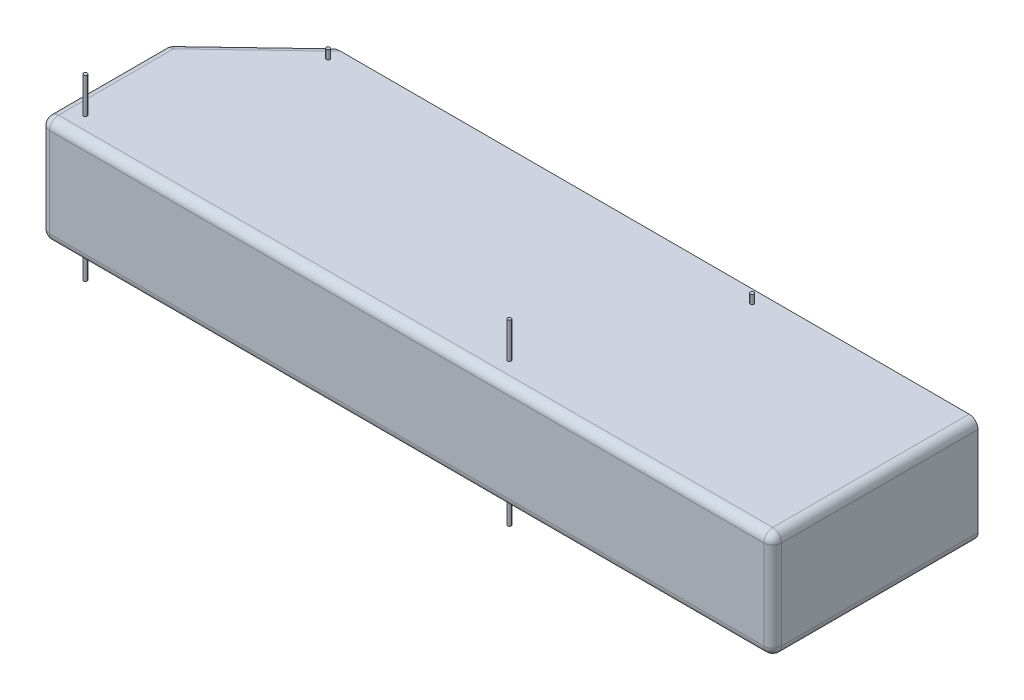
ISO-10303-21;
HEADER;
FILE_DESCRIPTION(('STEP AP214'),'2;1');
FILE_NAME('part.step','',(''),(''),'','','');
FILE_SCHEMA(('AUTOMOTIVE_DESIGN { 1 0 10303 214 1 1 1 1 }'));
ENDSEC;
DATA;
#1=APPLICATION_CONTEXT('core data for automotive mechanical design processes');
#2=APPLICATION_PROTOCOL_DEFINITION('international standard','automotive_design',2000,#1);
#3=PRODUCT_CONTEXT('',#1,'mechanical');
#4=PRODUCT('Part','Part','',(#3));
#5=PRODUCT_RELATED_PRODUCT_CATEGORY('part','',(#4));
#6=PRODUCT_DEFINITION_FORMATION('','',#4);
#7=PRODUCT_DEFINITION_CONTEXT('part definition',#1,'design');
#8=PRODUCT_DEFINITION('design','',#6,#7);
#9=PRODUCT_DEFINITION_SHAPE('','',#8);
#10=(LENGTH_UNIT() NAMED_UNIT(*) SI_UNIT(.MILLI.,.METRE.));
#11=(NAMED_UNIT(*) PLANE_ANGLE_UNIT() SI_UNIT($,.RADIAN.));
#12=(NAMED_UNIT(*) SI_UNIT($,.STERADIAN.) SOLID_ANGLE_UNIT());
#13=UNCERTAINTY_MEASURE_WITH_UNIT(LENGTH_MEASURE(1.E-05),#10,'distance_accuracy_value','');
#14=(GEOMETRIC_REPRESENTATION_CONTEXT(3) GLOBAL_UNCERTAINTY_ASSIGNED_CONTEXT((#13)) GLOBAL_UNIT_ASSIGNED_CONTEXT((#10,
#11,#12)) REPRESENTATION_CONTEXT('',''));
#15=CARTESIAN_POINT('',(0.,0.,0.));
#16=DIRECTION('',(0.,0.,1.));
#17=DIRECTION('',(1.,0.,0.));
#18=AXIS2_PLACEMENT_3D('',#15,#16,#17);
#19=CARTESIAN_POINT('',(-304.,99.9999999999999,14.));
#20=DIRECTION('',(0.,-1.,0.));
#21=DIRECTION('',(1.,0.,0.));
#22=AXIS2_PLACEMENT_3D('',#19,#20,#21);
#23=CYLINDRICAL_SURFACE('',#22,2.);
#24=CARTESIAN_POINT('',(-304.,60.,14.));
#25=DIRECTION('',(0.,-1.,0.));
#26=DIRECTION('',(1.,0.,0.));
#27=AXIS2_PLACEMENT_3D('',#24,#25,#26);
#28=CIRCLE('',#27,2.);
#29=CARTESIAN_POINT('',(-302.,60.,14.));
#30=VERTEX_POINT('',#29);
#31=EDGE_CURVE('E296',#30,#30,#28,.F.);
#32=ORIENTED_EDGE('',*,*,#31,.T.);
#33=EDGE_LOOP('',(#32));
#34=FACE_BOUND('',#33,.T.);
#35=CARTESIAN_POINT('',(-304.,70.,14.));
#36=DIRECTION('',(0.,1.,0.));
#37=DIRECTION('',(-1.,0.,0.));
#38=AXIS2_PLACEMENT_3D('',#35,#36,#37);
#39=CIRCLE('',#38,2.);
#40=CARTESIAN_POINT('',(-306.,70.,14.));
#41=VERTEX_POINT('',#40);
#42=EDGE_CURVE('E43',#41,#41,#39,.T.);
#43=ORIENTED_EDGE('',*,*,#42,.F.);
#44=EDGE_LOOP('',(#43));
#45=FACE_BOUND('',#44,.T.);
#46=ADVANCED_FACE('F39',(#34,#45),#23,.T.);
#47=CARTESIAN_POINT('',(171.,100.,14.));
#48=DIRECTION('',(0.,-1.,0.));
#49=DIRECTION('',(1.,0.,0.));
#50=AXIS2_PLACEMENT_3D('',#47,#48,#49);
#51=CYLINDRICAL_SURFACE('',#50,2.);
#52=CARTESIAN_POINT('',(171.,60.,14.));
#53=DIRECTION('',(0.,-1.,0.));
#54=DIRECTION('',(1.,0.,0.));
#55=AXIS2_PLACEMENT_3D('',#52,#53,#54);
#56=CIRCLE('',#55,2.);
#57=CARTESIAN_POINT('',(173.,60.,14.));
#58=VERTEX_POINT('',#57);
#59=EDGE_CURVE('E292',#58,#58,#56,.F.);
#60=ORIENTED_EDGE('',*,*,#59,.T.);
#61=EDGE_LOOP('',(#60));
#62=FACE_BOUND('',#61,.T.);
#63=CARTESIAN_POINT('',(171.,70.,14.));
#64=DIRECTION('',(0.,1.,0.));
#65=DIRECTION('',(-1.,0.,0.));
#66=AXIS2_PLACEMENT_3D('',#63,#64,#65);
#67=CIRCLE('',#66,2.);
#68=CARTESIAN_POINT('',(169.,70.,14.));
#69=VERTEX_POINT('',#68);
#70=EDGE_CURVE('E346',#69,#69,#67,.T.);
#71=ORIENTED_EDGE('',*,*,#70,.F.);
#72=EDGE_LOOP('',(#71));
#73=FACE_BOUND('',#72,.T.);
#74=ADVANCED_FACE('F362',(#62,#73),#51,.T.);
#75=CARTESIAN_POINT('',(171.,-100.,14.));
#76=DIRECTION('',(0.,1.,0.));
#77=DIRECTION('',(-1.,0.,0.));
#78=AXIS2_PLACEMENT_3D('',#75,#76,#77);
#79=CYLINDRICAL_SURFACE('',#78,2.);
#80=CARTESIAN_POINT('',(171.,-60.,14.));
#81=DIRECTION('',(0.,1.,0.));
#82=DIRECTION('',(-1.,0.,0.));
#83=AXIS2_PLACEMENT_3D('',#80,#81,#82);
#84=CIRCLE('',#83,2.);
#85=CARTESIAN_POINT('',(169.,-60.,14.));
#86=VERTEX_POINT('',#85);
#87=EDGE_CURVE('E276',#86,#86,#84,.F.);
#88=ORIENTED_EDGE('',*,*,#87,.T.);
#89=EDGE_LOOP('',(#88));
#90=FACE_BOUND('',#89,.T.);
#91=CARTESIAN_POINT('',(171.,-70.,14.));
#92=DIRECTION('',(0.,-1.,0.));
#93=DIRECTION('',(1.,0.,0.));
#94=AXIS2_PLACEMENT_3D('',#91,#92,#93);
#95=CIRCLE('',#94,2.);
#96=CARTESIAN_POINT('',(173.,-70.,14.));
#97=VERTEX_POINT('',#96);
#98=EDGE_CURVE('E349',#97,#97,#95,.T.);
#99=ORIENTED_EDGE('',*,*,#98,.F.);
#100=EDGE_LOOP('',(#99));
#101=FACE_BOUND('',#100,.T.);
#102=ADVANCED_FACE('F367',(#90,#101),#79,.T.);
#103=CARTESIAN_POINT('',(-304.,-100.,14.));
#104=DIRECTION('',(0.,1.,0.));
#105=DIRECTION('',(-1.,0.,0.));
#106=AXIS2_PLACEMENT_3D('',#103,#104,#105);
#107=CYLINDRICAL_SURFACE('',#106,2.);
#108=CARTESIAN_POINT('',(-304.,-60.,14.));
#109=DIRECTION('',(0.,1.,0.));
#110=DIRECTION('',(-1.,0.,0.));
#111=AXIS2_PLACEMENT_3D('',#108,#109,#110);
#112=CIRCLE('',#111,2.);
#113=CARTESIAN_POINT('',(-306.,-60.,14.));
#114=VERTEX_POINT('',#113);
#115=EDGE_CURVE('E280',#114,#114,#112,.F.);
#116=ORIENTED_EDGE('',*,*,#115,.T.);
#117=EDGE_LOOP('',(#116));
#118=FACE_BOUND('',#117,.T.);
#119=CARTESIAN_POINT('',(-304.,-70.,14.));
#120=DIRECTION('',(0.,-1.,0.));
#121=DIRECTION('',(1.,0.,0.));
#122=AXIS2_PLACEMENT_3D('',#119,#120,#121);
#123=CIRCLE('',#122,2.);
#124=CARTESIAN_POINT('',(-302.,-70.,14.));
#125=VERTEX_POINT('',#124);
#126=EDGE_CURVE('E334',#125,#125,#123,.T.);
#127=ORIENTED_EDGE('',*,*,#126,.F.);
#128=EDGE_LOOP('',(#127));
#129=FACE_BOUND('',#128,.T.);
#130=ADVANCED_FACE('F391',(#118,#129),#107,.T.);
#131=CARTESIAN_POINT('',(-400.,-50.,230.));
#132=DIRECTION('',(0.,0.,-1.));
#133=DIRECTION('',(-1.,0.,0.));
#134=AXIS2_PLACEMENT_3D('',#131,#132,#133);
#135=CYLINDRICAL_SURFACE('',#134,10.);
#136=DIRECTION('',(0.,0.,-1.));
#137=VECTOR('',#136,1.);
#138=CARTESIAN_POINT('',(-410.,-50.,230.));
#139=LINE('',#138,#137);
#140=CARTESIAN_POINT('',(-410.,-50.,220.));
#141=VERTEX_POINT('',#140);
#142=CARTESIAN_POINT('',(-410.,-50.,91.3643058150663));
#143=VERTEX_POINT('',#142);
#144=EDGE_CURVE('E183',#141,#143,#139,.T.);
#145=ORIENTED_EDGE('',*,*,#144,.T.);
#146=CARTESIAN_POINT('',(-400.,-50.,91.3643058150663));
#147=DIRECTION('',(0.,0.,-1.));
#148=DIRECTION('',(-1.,0.,0.));
#149=AXIS2_PLACEMENT_3D('',#146,#147,#148);
#150=CIRCLE('',#149,10.);
#151=CARTESIAN_POINT('',(-400.,-60.0000000000001,91.3643058150663));
#152=VERTEX_POINT('',#151);
#153=EDGE_CURVE('E49',#143,#152,#150,.F.);
#154=ORIENTED_EDGE('',*,*,#153,.T.);
#155=DIRECTION('',(0.,0.,-1.));
#156=VECTOR('',#155,1.);
#157=CARTESIAN_POINT('',(-400.,-60.0000000000001,230.));
#158=LINE('',#157,#156);
#159=CARTESIAN_POINT('',(-400.,-60.0000000000001,220.));
#160=VERTEX_POINT('',#159);
#161=EDGE_CURVE('E159',#160,#152,#158,.T.);
#162=ORIENTED_EDGE('',*,*,#161,.F.);
#163=CARTESIAN_POINT('',(-400.,-50.,220.));
#164=DIRECTION('',(0.,0.,-1.));
#165=DIRECTION('',(-1.,0.,0.));
#166=AXIS2_PLACEMENT_3D('',#163,#164,#165);
#167=CIRCLE('',#166,10.);
#168=EDGE_CURVE('E203',#160,#141,#167,.T.);
#169=ORIENTED_EDGE('',*,*,#168,.T.);
#170=EDGE_LOOP('',(#145,#154,#162,#169));
#171=FACE_BOUND('',#170,.T.);
#172=ADVANCED_FACE('F394',(#171),#135,.T.);
#173=CARTESIAN_POINT('',(400.,-60.,230.));
#174=DIRECTION('',(0.,1.,0.));
#175=DIRECTION('',(-1.,0.,0.));
#176=AXIS2_PLACEMENT_3D('',#173,#174,#175);
#177=PLANE('',#176);
#178=ORIENTED_EDGE('',*,*,#115,.F.);
#179=EDGE_LOOP('',(#178));
#180=FACE_BOUND('',#179,.T.);
#181=ORIENTED_EDGE('',*,*,#87,.F.);
#182=EDGE_LOOP('',(#181));
#183=FACE_BOUND('',#182,.T.);
#184=CARTESIAN_POINT('',(90.,-60.,205.));
#185=DIRECTION('',(0.,1.,0.));
#186=DIRECTION('',(-1.,0.,0.));
#187=AXIS2_PLACEMENT_3D('',#184,#185,#186);
#188=CIRCLE('',#187,2.);
#189=CARTESIAN_POINT('',(88.,-60.,205.));
#190=VERTEX_POINT('',#189);
#191=EDGE_CURVE('E272',#190,#190,#188,.F.);
#192=ORIENTED_EDGE('',*,*,#191,.F.);
#193=EDGE_LOOP('',(#192));
#194=FACE_BOUND('',#193,.T.);
#195=CARTESIAN_POINT('',(-385.,-60.0000000000001,205.));
#196=DIRECTION('',(0.,1.,0.));
#197=DIRECTION('',(-1.,0.,0.));
#198=AXIS2_PLACEMENT_3D('',#195,#196,#197);
#199=CIRCLE('',#198,2.);
#200=CARTESIAN_POINT('',(-387.,-60.0000000000001,205.));
#201=VERTEX_POINT('',#200);
#202=EDGE_CURVE('E239',#201,#201,#199,.F.);
#203=ORIENTED_EDGE('',*,*,#202,.F.);
#204=EDGE_LOOP('',(#203));
#205=FACE_BOUND('',#204,.T.);
#206=ORIENTED_EDGE('',*,*,#161,.T.);
#207=DIRECTION('',(-0.724195431730641,0.,0.689594791642505));
#208=VECTOR('',#207,1.);
#209=CARTESIAN_POINT('',(-49.6676407966176,-60.,-242.229859054425));
#210=LINE('',#209,#208);
#211=CARTESIAN_POINT('',(-304.051460805096,-60.,0.));
#212=VERTEX_POINT('',#211);
#213=EDGE_CURVE('E11',#152,#212,#210,.F.);
#214=ORIENTED_EDGE('',*,*,#213,.T.);
#215=DIRECTION('',(1.,0.,0.));
#216=VECTOR('',#215,1.);
#217=CARTESIAN_POINT('',(400.,-60.,0.));
#218=LINE('',#217,#216);
#219=CARTESIAN_POINT('',(400.,-60.,0.));
#220=VERTEX_POINT('',#219);
#221=EDGE_CURVE('E138',#212,#220,#218,.T.);
#222=ORIENTED_EDGE('',*,*,#221,.T.);
#223=DIRECTION('',(0.,0.,-1.));
#224=VECTOR('',#223,1.);
#225=CARTESIAN_POINT('',(400.,-60.,230.));
#226=LINE('',#225,#224);
#227=CARTESIAN_POINT('',(400.,-60.,220.));
#228=VERTEX_POINT('',#227);
#229=EDGE_CURVE('E141',#228,#220,#226,.T.);
#230=ORIENTED_EDGE('',*,*,#229,.F.);
#231=DIRECTION('',(1.,0.,0.));
#232=VECTOR('',#231,1.);
#233=CARTESIAN_POINT('',(400.,-60.,220.));
#234=LINE('',#233,#232);
#235=EDGE_CURVE('E236',#228,#160,#234,.F.);
#236=ORIENTED_EDGE('',*,*,#235,.T.);
#237=EDGE_LOOP('',(#206,#214,#222,#230,#236));
#238=FACE_BOUND('',#237,.T.);
#239=ADVANCED_FACE('F140',(#180,#183,#194,#205,#238),#177,.F.);
#240=CARTESIAN_POINT('',(400.,-50.,230.));
#241=DIRECTION('',(0.,0.,-1.));
#242=DIRECTION('',(-1.,0.,0.));
#243=AXIS2_PLACEMENT_3D('',#240,#241,#242);
#244=CYLINDRICAL_SURFACE('',#243,10.);
#245=DIRECTION('',(0.,0.,-1.));
#246=VECTOR('',#245,1.);
#247=CARTESIAN_POINT('',(410.,-50.,230.));
#248=LINE('',#247,#246);
#249=CARTESIAN_POINT('',(410.,-50.,220.));
#250=VERTEX_POINT('',#249);
#251=CARTESIAN_POINT('',(410.,-50.,0.));
#252=VERTEX_POINT('',#251);
#253=EDGE_CURVE('E160',#250,#252,#248,.T.);
#254=ORIENTED_EDGE('',*,*,#253,.F.);
#255=CARTESIAN_POINT('',(400.,-50.,220.));
#256=DIRECTION('',(0.,0.,-1.));
#257=DIRECTION('',(-1.,0.,0.));
#258=AXIS2_PLACEMENT_3D('',#255,#256,#257);
#259=CIRCLE('',#258,10.);
#260=EDGE_CURVE('E157',#250,#228,#259,.T.);
#261=ORIENTED_EDGE('',*,*,#260,.T.);
#262=ORIENTED_EDGE('',*,*,#229,.T.);
#263=CARTESIAN_POINT('',(400.,-50.,0.));
#264=DIRECTION('',(0.,0.,1.));
#265=DIRECTION('',(1.,0.,0.));
#266=AXIS2_PLACEMENT_3D('',#263,#264,#265);
#267=CIRCLE('',#266,10.);
#268=EDGE_CURVE('E148',#220,#252,#267,.T.);
#269=ORIENTED_EDGE('',*,*,#268,.T.);
#270=EDGE_LOOP('',(#254,#261,#262,#269));
#271=FACE_BOUND('',#270,.T.);
#272=ADVANCED_FACE('F154',(#271),#244,.T.);
#273=CARTESIAN_POINT('',(410.,50.,230.));
#274=DIRECTION('',(-1.,0.,0.));
#275=DIRECTION('',(0.,0.,1.));
#276=AXIS2_PLACEMENT_3D('',#273,#274,#275);
#277=PLANE('',#276);
#278=DIRECTION('',(0.,0.,-1.));
#279=VECTOR('',#278,1.);
#280=CARTESIAN_POINT('',(410.,50.,230.));
#281=LINE('',#280,#279);
#282=CARTESIAN_POINT('',(410.,50.,220.));
#283=VERTEX_POINT('',#282);
#284=CARTESIAN_POINT('',(410.,50.,0.));
#285=VERTEX_POINT('',#284);
#286=EDGE_CURVE('E196',#283,#285,#281,.T.);
#287=ORIENTED_EDGE('',*,*,#286,.F.);
#288=DIRECTION('',(0.,1.,0.));
#289=VECTOR('',#288,1.);
#290=CARTESIAN_POINT('',(410.,50.,220.));
#291=LINE('',#290,#289);
#292=EDGE_CURVE('E231',#283,#250,#291,.F.);
#293=ORIENTED_EDGE('',*,*,#292,.T.);
#294=ORIENTED_EDGE('',*,*,#253,.T.);
#295=DIRECTION('',(0.,1.,0.));
#296=VECTOR('',#295,1.);
#297=CARTESIAN_POINT('',(410.,50.,0.));
#298=LINE('',#297,#296);
#299=EDGE_CURVE('E166',#252,#285,#298,.T.);
#300=ORIENTED_EDGE('',*,*,#299,.T.);
#301=EDGE_LOOP('',(#287,#293,#294,#300));
#302=FACE_BOUND('',#301,.T.);
#303=ADVANCED_FACE('F436',(#302),#277,.F.);
#304=CARTESIAN_POINT('',(400.,50.,230.));
#305=DIRECTION('',(0.,0.,-1.));
#306=DIRECTION('',(-1.,0.,0.));
#307=AXIS2_PLACEMENT_3D('',#304,#305,#306);
#308=CYLINDRICAL_SURFACE('',#307,10.);
#309=DIRECTION('',(0.,0.,-1.));
#310=VECTOR('',#309,1.);
#311=CARTESIAN_POINT('',(400.,60.,230.));
#312=LINE('',#311,#310);
#313=CARTESIAN_POINT('',(400.,60.,220.));
#314=VERTEX_POINT('',#313);
#315=CARTESIAN_POINT('',(400.,60.,0.));
#316=VERTEX_POINT('',#315);
#317=EDGE_CURVE('E193',#314,#316,#312,.T.);
#318=ORIENTED_EDGE('',*,*,#317,.F.);
#319=CARTESIAN_POINT('',(400.,50.,220.));
#320=DIRECTION('',(0.,0.,-1.));
#321=DIRECTION('',(-1.,0.,0.));
#322=AXIS2_PLACEMENT_3D('',#319,#320,#321);
#323=CIRCLE('',#322,10.);
#324=EDGE_CURVE('E229',#314,#283,#323,.T.);
#325=ORIENTED_EDGE('',*,*,#324,.T.);
#326=ORIENTED_EDGE('',*,*,#286,.T.);
#327=CARTESIAN_POINT('',(400.,50.,0.));
#328=DIRECTION('',(0.,0.,1.));
#329=DIRECTION('',(1.,0.,0.));
#330=AXIS2_PLACEMENT_3D('',#327,#328,#329);
#331=CIRCLE('',#330,10.);
#332=EDGE_CURVE('E172',#285,#316,#331,.T.);
#333=ORIENTED_EDGE('',*,*,#332,.T.);
#334=EDGE_LOOP('',(#318,#325,#326,#333));
#335=FACE_BOUND('',#334,.T.);
#336=ADVANCED_FACE('F432',(#335),#308,.T.);
#337=CARTESIAN_POINT('',(400.,60.,230.));
#338=DIRECTION('',(0.,-1.,0.));
#339=DIRECTION('',(1.,0.,0.));
#340=AXIS2_PLACEMENT_3D('',#337,#338,#339);
#341=PLANE('',#340);
#342=ORIENTED_EDGE('',*,*,#31,.F.);
#343=EDGE_LOOP('',(#342));
#344=FACE_BOUND('',#343,.T.);
#345=ORIENTED_EDGE('',*,*,#59,.F.);
#346=EDGE_LOOP('',(#345));
#347=FACE_BOUND('',#346,.T.);
#348=CARTESIAN_POINT('',(90.,60.,205.));
#349=DIRECTION('',(0.,-1.,0.));
#350=DIRECTION('',(1.,0.,0.));
#351=AXIS2_PLACEMENT_3D('',#348,#349,#350);
#352=CIRCLE('',#351,2.);
#353=CARTESIAN_POINT('',(92.,60.,205.));
#354=VERTEX_POINT('',#353);
#355=EDGE_CURVE('E288',#354,#354,#352,.F.);
#356=ORIENTED_EDGE('',*,*,#355,.F.);
#357=EDGE_LOOP('',(#356));
#358=FACE_BOUND('',#357,.T.);
#359=CARTESIAN_POINT('',(-385.,59.9999999999999,205.));
#360=DIRECTION('',(0.,-1.,0.));
#361=DIRECTION('',(1.,0.,0.));
#362=AXIS2_PLACEMENT_3D('',#359,#360,#361);
#363=CIRCLE('',#362,2.);
#364=CARTESIAN_POINT('',(-383.,59.9999999999999,205.));
#365=VERTEX_POINT('',#364);
#366=EDGE_CURVE('E284',#365,#365,#363,.F.);
#367=ORIENTED_EDGE('',*,*,#366,.F.);
#368=EDGE_LOOP('',(#367));
#369=FACE_BOUND('',#368,.T.);
#370=DIRECTION('',(-1.,0.,0.));
#371=VECTOR('',#370,1.);
#372=CARTESIAN_POINT('',(400.,60.,0.));
#373=LINE('',#372,#371);
#374=CARTESIAN_POINT('',(-304.051460805096,60.,0.));
#375=VERTEX_POINT('',#374);
#376=EDGE_CURVE('E179',#316,#375,#373,.T.);
#377=ORIENTED_EDGE('',*,*,#376,.T.);
#378=DIRECTION('',(-0.724195431730641,0.,0.689594791642505));
#379=VECTOR('',#378,1.);
#380=CARTESIAN_POINT('',(-49.6676407966175,60.,-242.229859054425));
#381=LINE('',#380,#379);
#382=CARTESIAN_POINT('',(-400.,59.9999999999999,91.3643058150663));
#383=VERTEX_POINT('',#382);
#384=EDGE_CURVE('E304',#375,#383,#381,.T.);
#385=ORIENTED_EDGE('',*,*,#384,.T.);
#386=DIRECTION('',(0.,0.,-1.));
#387=VECTOR('',#386,1.);
#388=CARTESIAN_POINT('',(-400.,59.9999999999999,230.));
#389=LINE('',#388,#387);
#390=CARTESIAN_POINT('',(-400.,59.9999999999999,220.));
#391=VERTEX_POINT('',#390);
#392=EDGE_CURVE('E189',#391,#383,#389,.T.);
#393=ORIENTED_EDGE('',*,*,#392,.F.);
#394=DIRECTION('',(-1.,0.,0.));
#395=VECTOR('',#394,1.);
#396=CARTESIAN_POINT('',(400.,60.,220.));
#397=LINE('',#396,#395);
#398=EDGE_CURVE('E226',#391,#314,#397,.F.);
#399=ORIENTED_EDGE('',*,*,#398,.T.);
#400=ORIENTED_EDGE('',*,*,#317,.T.);
#401=EDGE_LOOP('',(#377,#385,#393,#399,#400));
#402=FACE_BOUND('',#401,.T.);
#403=ADVANCED_FACE('F428',(#344,#347,#358,#369,#402),#341,.F.);
#404=CARTESIAN_POINT('',(-400.,50.,230.));
#405=DIRECTION('',(0.,0.,-1.));
#406=DIRECTION('',(-1.,0.,0.));
#407=AXIS2_PLACEMENT_3D('',#404,#405,#406);
#408=CYLINDRICAL_SURFACE('',#407,10.);
#409=ORIENTED_EDGE('',*,*,#392,.T.);
#410=CARTESIAN_POINT('',(-400.,50.,91.3643058150663));
#411=DIRECTION('',(0.,0.,-1.));
#412=DIRECTION('',(-1.,0.,0.));
#413=AXIS2_PLACEMENT_3D('',#410,#411,#412);
#414=CIRCLE('',#413,10.);
#415=CARTESIAN_POINT('',(-410.,50.,91.3643058150663));
#416=VERTEX_POINT('',#415);
#417=EDGE_CURVE('E323',#383,#416,#414,.F.);
#418=ORIENTED_EDGE('',*,*,#417,.T.);
#419=DIRECTION('',(0.,0.,-1.));
#420=VECTOR('',#419,1.);
#421=CARTESIAN_POINT('',(-410.,50.,230.));
#422=LINE('',#421,#420);
#423=CARTESIAN_POINT('',(-410.,50.,220.));
#424=VERTEX_POINT('',#423);
#425=EDGE_CURVE('E186',#424,#416,#422,.T.);
#426=ORIENTED_EDGE('',*,*,#425,.F.);
#427=CARTESIAN_POINT('',(-400.,50.,220.));
#428=DIRECTION('',(0.,0.,-1.));
#429=DIRECTION('',(-1.,0.,0.));
#430=AXIS2_PLACEMENT_3D('',#427,#428,#429);
#431=CIRCLE('',#430,10.);
#432=EDGE_CURVE('E223',#424,#391,#431,.T.);
#433=ORIENTED_EDGE('',*,*,#432,.T.);
#434=EDGE_LOOP('',(#409,#418,#426,#433));
#435=FACE_BOUND('',#434,.T.);
#436=ADVANCED_FACE('F425',(#435),#408,.T.);
#437=CARTESIAN_POINT('',(-410.,50.,230.));
#438=DIRECTION('',(1.,0.,0.));
#439=DIRECTION('',(0.,0.,-1.));
#440=AXIS2_PLACEMENT_3D('',#437,#438,#439);
#441=PLANE('',#440);
#442=ORIENTED_EDGE('',*,*,#425,.T.);
#443=DIRECTION('',(0.,-1.,0.));
#444=VECTOR('',#443,1.);
#445=CARTESIAN_POINT('',(-410.,49.9999999999999,91.3643058150663));
#446=LINE('',#445,#444);
#447=EDGE_CURVE('E64',#416,#143,#446,.T.);
#448=ORIENTED_EDGE('',*,*,#447,.T.);
#449=ORIENTED_EDGE('',*,*,#144,.F.);
#450=DIRECTION('',(0.,-1.,0.));
#451=VECTOR('',#450,1.);
#452=CARTESIAN_POINT('',(-410.,50.,220.));
#453=LINE('',#452,#451);
#454=EDGE_CURVE('E220',#141,#424,#453,.F.);
#455=ORIENTED_EDGE('',*,*,#454,.T.);
#456=EDGE_LOOP('',(#442,#448,#449,#455));
#457=FACE_BOUND('',#456,.T.);
#458=ADVANCED_FACE('F418',(#457),#441,.F.);
#459=CARTESIAN_POINT('',(-400.,-50.,230.));
#460=DIRECTION('',(0.,0.,-1.));
#461=DIRECTION('',(-1.,0.,0.));
#462=AXIS2_PLACEMENT_3D('',#459,#460,#461);
#463=PLANE('',#462);
#464=DIRECTION('',(-1.,0.,0.));
#465=VECTOR('',#464,1.);
#466=CARTESIAN_POINT('',(-400.,49.9999999999999,230.));
#467=LINE('',#466,#465);
#468=CARTESIAN_POINT('',(400.,50.,230.));
#469=VERTEX_POINT('',#468);
#470=CARTESIAN_POINT('',(-400.,49.9999999999999,230.));
#471=VERTEX_POINT('',#470);
#472=EDGE_CURVE('E213',#469,#471,#467,.T.);
#473=ORIENTED_EDGE('',*,*,#472,.T.);
#474=DIRECTION('',(0.,-1.,0.));
#475=VECTOR('',#474,1.);
#476=CARTESIAN_POINT('',(-400.,-50.,230.));
#477=LINE('',#476,#475);
#478=CARTESIAN_POINT('',(-400.,-50.,230.));
#479=VERTEX_POINT('',#478);
#480=EDGE_CURVE('E216',#471,#479,#477,.T.);
#481=ORIENTED_EDGE('',*,*,#480,.T.);
#482=DIRECTION('',(1.,0.,0.));
#483=VECTOR('',#482,1.);
#484=CARTESIAN_POINT('',(-400.,-50.,230.));
#485=LINE('',#484,#483);
#486=CARTESIAN_POINT('',(400.,-50.,230.));
#487=VERTEX_POINT('',#486);
#488=EDGE_CURVE('E207',#479,#487,#485,.T.);
#489=ORIENTED_EDGE('',*,*,#488,.T.);
#490=DIRECTION('',(0.,1.,0.));
#491=VECTOR('',#490,1.);
#492=CARTESIAN_POINT('',(400.,-50.,230.));
#493=LINE('',#492,#491);
#494=EDGE_CURVE('E210',#487,#469,#493,.T.);
#495=ORIENTED_EDGE('',*,*,#494,.T.);
#496=EDGE_LOOP('',(#473,#481,#489,#495));
#497=FACE_BOUND('',#496,.T.);
#498=ADVANCED_FACE('F415',(#497),#463,.F.);
#499=CARTESIAN_POINT('',(-400.,-50.,0.));
#500=DIRECTION('',(0.,0.,-1.));
#501=DIRECTION('',(-1.,0.,0.));
#502=AXIS2_PLACEMENT_3D('',#499,#500,#501);
#503=PLANE('',#502);
#504=DIRECTION('',(0.,-1.,0.));
#505=VECTOR('',#504,1.);
#506=CARTESIAN_POINT('',(-318.55273042197,-50.,0.));
#507=LINE('',#506,#505);
#508=CARTESIAN_POINT('',(-318.55273042197,50.,0.));
#509=VERTEX_POINT('',#508);
#510=CARTESIAN_POINT('',(-318.55273042197,-50.,0.));
#511=VERTEX_POINT('',#510);
#512=EDGE_CURVE('E300',#509,#511,#507,.T.);
#513=ORIENTED_EDGE('',*,*,#512,.F.);
#514=CARTESIAN_POINT('',(-304.051460805096,50.,0.));
#515=DIRECTION('',(0.,0.,-1.));
#516=DIRECTION('',(-1.,0.,0.));
#517=AXIS2_PLACEMENT_3D('',#514,#515,#516);
#518=ELLIPSE('',#517,14.501269616874,10.);
#519=EDGE_CURVE('E320',#509,#375,#518,.T.);
#520=ORIENTED_EDGE('',*,*,#519,.T.);
#521=ORIENTED_EDGE('',*,*,#376,.F.);
#522=ORIENTED_EDGE('',*,*,#332,.F.);
#523=ORIENTED_EDGE('',*,*,#299,.F.);
#524=ORIENTED_EDGE('',*,*,#268,.F.);
#525=ORIENTED_EDGE('',*,*,#221,.F.);
#526=CARTESIAN_POINT('',(-304.051460805096,-50.,0.));
#527=DIRECTION('',(0.,0.,-1.));
#528=DIRECTION('',(-1.,0.,0.));
#529=AXIS2_PLACEMENT_3D('',#526,#527,#528);
#530=ELLIPSE('',#529,14.501269616874,10.);
#531=EDGE_CURVE('E317',#212,#511,#530,.T.);
#532=ORIENTED_EDGE('',*,*,#531,.T.);
#533=EDGE_LOOP('',(#513,#520,#521,#522,#523,#524,#525,#532));
#534=FACE_BOUND('',#533,.T.);
#535=ADVANCED_FACE('F163',(#534),#503,.T.);
#536=CARTESIAN_POINT('',(400.,50.,220.));
#537=DIRECTION('',(0.,0.,-1.));
#538=DIRECTION('',(-1.,0.,0.));
#539=AXIS2_PLACEMENT_3D('',#536,#537,#538);
#540=SPHERICAL_SURFACE('',#539,10.);
#541=CARTESIAN_POINT('',(400.,50.,220.));
#542=DIRECTION('',(0.,-1.,0.));
#543=DIRECTION('',(0.,0.,-1.));
#544=AXIS2_PLACEMENT_3D('',#541,#542,#543);
#545=CIRCLE('',#544,10.);
#546=EDGE_CURVE('E262',#283,#469,#545,.T.);
#547=ORIENTED_EDGE('',*,*,#546,.F.);
#548=ORIENTED_EDGE('',*,*,#324,.F.);
#549=CARTESIAN_POINT('',(400.,50.,220.));
#550=DIRECTION('',(-1.,0.,0.));
#551=DIRECTION('',(0.,0.,1.));
#552=AXIS2_PLACEMENT_3D('',#549,#550,#551);
#553=CIRCLE('',#552,10.);
#554=EDGE_CURVE('E149',#469,#314,#553,.T.);
#555=ORIENTED_EDGE('',*,*,#554,.F.);
#556=EDGE_LOOP('',(#547,#548,#555));
#557=FACE_BOUND('',#556,.T.);
#558=ADVANCED_FACE('F422',(#557),#540,.T.);
#559=CARTESIAN_POINT('',(-400.,49.9999999999999,220.));
#560=DIRECTION('',(-1.,0.,0.));
#561=DIRECTION('',(0.,-1.,0.));
#562=AXIS2_PLACEMENT_3D('',#559,#560,#561);
#563=CYLINDRICAL_SURFACE('',#562,10.);
#564=ORIENTED_EDGE('',*,*,#554,.T.);
#565=ORIENTED_EDGE('',*,*,#398,.F.);
#566=CARTESIAN_POINT('',(-400.,49.9999999999999,220.));
#567=DIRECTION('',(-1.,0.,0.));
#568=DIRECTION('',(0.,0.,1.));
#569=AXIS2_PLACEMENT_3D('',#566,#567,#568);
#570=CIRCLE('',#569,10.);
#571=EDGE_CURVE('E258',#471,#391,#570,.T.);
#572=ORIENTED_EDGE('',*,*,#571,.F.);
#573=ORIENTED_EDGE('',*,*,#472,.F.);
#574=EDGE_LOOP('',(#564,#565,#572,#573));
#575=FACE_BOUND('',#574,.T.);
#576=ADVANCED_FACE('F470',(#575),#563,.T.);
#577=CARTESIAN_POINT('',(400.,-50.,220.));
#578=DIRECTION('',(0.,1.,0.));
#579=DIRECTION('',(0.,0.,1.));
#580=AXIS2_PLACEMENT_3D('',#577,#578,#579);
#581=CYLINDRICAL_SURFACE('',#580,10.);
#582=ORIENTED_EDGE('',*,*,#546,.T.);
#583=ORIENTED_EDGE('',*,*,#494,.F.);
#584=CARTESIAN_POINT('',(400.,-50.,220.));
#585=DIRECTION('',(0.,-1.,0.));
#586=DIRECTION('',(0.,0.,-1.));
#587=AXIS2_PLACEMENT_3D('',#584,#585,#586);
#588=CIRCLE('',#587,10.);
#589=EDGE_CURVE('E254',#250,#487,#588,.T.);
#590=ORIENTED_EDGE('',*,*,#589,.F.);
#591=ORIENTED_EDGE('',*,*,#292,.F.);
#592=EDGE_LOOP('',(#582,#583,#590,#591));
#593=FACE_BOUND('',#592,.T.);
#594=ADVANCED_FACE('F466',(#593),#581,.T.);
#595=CARTESIAN_POINT('',(-400.,50.,220.));
#596=DIRECTION('',(0.,0.,-1.));
#597=DIRECTION('',(-1.,0.,0.));
#598=AXIS2_PLACEMENT_3D('',#595,#596,#597);
#599=SPHERICAL_SURFACE('',#598,10.);
#600=ORIENTED_EDGE('',*,*,#571,.T.);
#601=ORIENTED_EDGE('',*,*,#432,.F.);
#602=CARTESIAN_POINT('',(-400.,50.,220.));
#603=DIRECTION('',(0.,-1.,0.));
#604=DIRECTION('',(0.,0.,-1.));
#605=AXIS2_PLACEMENT_3D('',#602,#603,#604);
#606=CIRCLE('',#605,10.);
#607=EDGE_CURVE('E250',#471,#424,#606,.T.);
#608=ORIENTED_EDGE('',*,*,#607,.F.);
#609=EDGE_LOOP('',(#600,#601,#608));
#610=FACE_BOUND('',#609,.T.);
#611=ADVANCED_FACE('F462',(#610),#599,.T.);
#612=CARTESIAN_POINT('',(400.,-50.,220.));
#613=DIRECTION('',(0.,0.,-1.));
#614=DIRECTION('',(-1.,0.,0.));
#615=AXIS2_PLACEMENT_3D('',#612,#613,#614);
#616=SPHERICAL_SURFACE('',#615,10.);
#617=ORIENTED_EDGE('',*,*,#260,.F.);
#618=ORIENTED_EDGE('',*,*,#589,.T.);
#619=CARTESIAN_POINT('',(400.,-50.,220.));
#620=DIRECTION('',(-1.,0.,0.));
#621=DIRECTION('',(0.,0.,1.));
#622=AXIS2_PLACEMENT_3D('',#619,#620,#621);
#623=CIRCLE('',#622,10.);
#624=EDGE_CURVE('E246',#228,#487,#623,.T.);
#625=ORIENTED_EDGE('',*,*,#624,.F.);
#626=EDGE_LOOP('',(#617,#618,#625));
#627=FACE_BOUND('',#626,.T.);
#628=ADVANCED_FACE('F458',(#627),#616,.T.);
#629=CARTESIAN_POINT('',(-400.,-50.,220.));
#630=DIRECTION('',(0.,-1.,0.));
#631=DIRECTION('',(0.,0.,-1.));
#632=AXIS2_PLACEMENT_3D('',#629,#630,#631);
#633=CYLINDRICAL_SURFACE('',#632,10.);
#634=ORIENTED_EDGE('',*,*,#607,.T.);
#635=ORIENTED_EDGE('',*,*,#454,.F.);
#636=CARTESIAN_POINT('',(-400.,-50.,220.));
#637=DIRECTION('',(0.,-1.,0.));
#638=DIRECTION('',(0.,0.,-1.));
#639=AXIS2_PLACEMENT_3D('',#636,#637,#638);
#640=CIRCLE('',#639,10.);
#641=EDGE_CURVE('E243',#479,#141,#640,.T.);
#642=ORIENTED_EDGE('',*,*,#641,.F.);
#643=ORIENTED_EDGE('',*,*,#480,.F.);
#644=EDGE_LOOP('',(#634,#635,#642,#643));
#645=FACE_BOUND('',#644,.T.);
#646=ADVANCED_FACE('F454',(#645),#633,.T.);
#647=CARTESIAN_POINT('',(-400.,-50.,220.));
#648=DIRECTION('',(1.,0.,0.));
#649=DIRECTION('',(0.,1.,0.));
#650=AXIS2_PLACEMENT_3D('',#647,#648,#649);
#651=CYLINDRICAL_SURFACE('',#650,10.);
#652=ORIENTED_EDGE('',*,*,#624,.T.);
#653=ORIENTED_EDGE('',*,*,#488,.F.);
#654=CARTESIAN_POINT('',(-400.,-50.,220.));
#655=DIRECTION('',(-1.,0.,0.));
#656=DIRECTION('',(0.,0.,1.));
#657=AXIS2_PLACEMENT_3D('',#654,#655,#656);
#658=CIRCLE('',#657,10.);
#659=EDGE_CURVE('E240',#160,#479,#658,.T.);
#660=ORIENTED_EDGE('',*,*,#659,.F.);
#661=ORIENTED_EDGE('',*,*,#235,.F.);
#662=EDGE_LOOP('',(#652,#653,#660,#661));
#663=FACE_BOUND('',#662,.T.);
#664=ADVANCED_FACE('F450',(#663),#651,.T.);
#665=CARTESIAN_POINT('',(-400.,-50.,220.));
#666=DIRECTION('',(0.,0.,-1.));
#667=DIRECTION('',(-1.,0.,0.));
#668=AXIS2_PLACEMENT_3D('',#665,#666,#667);
#669=SPHERICAL_SURFACE('',#668,10.);
#670=ORIENTED_EDGE('',*,*,#641,.T.);
#671=ORIENTED_EDGE('',*,*,#168,.F.);
#672=ORIENTED_EDGE('',*,*,#659,.T.);
#673=EDGE_LOOP('',(#670,#671,#672));
#674=FACE_BOUND('',#673,.T.);
#675=ADVANCED_FACE('F413',(#674),#669,.T.);
#676=CARTESIAN_POINT('',(-385.,-100.,205.));
#677=DIRECTION('',(0.,1.,0.));
#678=DIRECTION('',(-1.,0.,0.));
#679=AXIS2_PLACEMENT_3D('',#676,#677,#678);
#680=CYLINDRICAL_SURFACE('',#679,2.);
#681=CARTESIAN_POINT('',(-385.,-100.,205.));
#682=DIRECTION('',(0.,-1.,0.));
#683=DIRECTION('',(1.,0.,0.));
#684=AXIS2_PLACEMENT_3D('',#681,#682,#683);
#685=CIRCLE('',#684,2.);
#686=CARTESIAN_POINT('',(-383.,-100.,205.));
#687=VERTEX_POINT('',#686);
#688=EDGE_CURVE('E244',#687,#687,#685,.T.);
#689=ORIENTED_EDGE('',*,*,#688,.F.);
#690=EDGE_LOOP('',(#689));
#691=FACE_BOUND('',#690,.T.);
#692=ORIENTED_EDGE('',*,*,#202,.T.);
#693=EDGE_LOOP('',(#692));
#694=FACE_BOUND('',#693,.T.);
#695=ADVANCED_FACE('F409',(#691,#694),#680,.T.);
#696=CARTESIAN_POINT('',(-385.,-100.,205.));
#697=DIRECTION('',(0.,-1.,0.));
#698=DIRECTION('',(1.,0.,0.));
#699=AXIS2_PLACEMENT_3D('',#696,#697,#698);
#700=PLANE('',#699);
#701=ORIENTED_EDGE('',*,*,#688,.T.);
#702=EDGE_LOOP('',(#701));
#703=FACE_BOUND('',#702,.T.);
#704=ADVANCED_FACE('F405',(#703),#700,.T.);
#705=CARTESIAN_POINT('',(90.,-100.,205.));
#706=DIRECTION('',(0.,1.,0.));
#707=DIRECTION('',(-1.,0.,0.));
#708=AXIS2_PLACEMENT_3D('',#705,#706,#707);
#709=CYLINDRICAL_SURFACE('',#708,2.);
#710=CARTESIAN_POINT('',(90.,-100.,205.));
#711=DIRECTION('',(0.,-1.,0.));
#712=DIRECTION('',(1.,0.,0.));
#713=AXIS2_PLACEMENT_3D('',#710,#711,#712);
#714=CIRCLE('',#713,2.);
#715=CARTESIAN_POINT('',(92.,-100.,205.));
#716=VERTEX_POINT('',#715);
#717=EDGE_CURVE('E837',#716,#716,#714,.T.);
#718=ORIENTED_EDGE('',*,*,#717,.F.);
#719=EDGE_LOOP('',(#718));
#720=FACE_BOUND('',#719,.T.);
#721=ORIENTED_EDGE('',*,*,#191,.T.);
#722=EDGE_LOOP('',(#721));
#723=FACE_BOUND('',#722,.T.);
#724=ADVANCED_FACE('F401',(#720,#723),#709,.T.);
#725=CARTESIAN_POINT('',(90.,-100.,205.));
#726=DIRECTION('',(0.,-1.,0.));
#727=DIRECTION('',(1.,0.,0.));
#728=AXIS2_PLACEMENT_3D('',#725,#726,#727);
#729=PLANE('',#728);
#730=ORIENTED_EDGE('',*,*,#717,.T.);
#731=EDGE_LOOP('',(#730));
#732=FACE_BOUND('',#731,.T.);
#733=ADVANCED_FACE('F389',(#732),#729,.T.);
#734=CARTESIAN_POINT('',(-385.,99.9999999999999,205.));
#735=DIRECTION('',(0.,-1.,0.));
#736=DIRECTION('',(1.,0.,0.));
#737=AXIS2_PLACEMENT_3D('',#734,#735,#736);
#738=CYLINDRICAL_SURFACE('',#737,2.);
#739=CARTESIAN_POINT('',(-385.,99.9999999999999,205.));
#740=DIRECTION('',(0.,1.,0.));
#741=DIRECTION('',(-1.,0.,0.));
#742=AXIS2_PLACEMENT_3D('',#739,#740,#741);
#743=CIRCLE('',#742,2.);
#744=CARTESIAN_POINT('',(-387.,99.9999999999999,205.));
#745=VERTEX_POINT('',#744);
#746=EDGE_CURVE('E833',#745,#745,#743,.T.);
#747=ORIENTED_EDGE('',*,*,#746,.F.);
#748=EDGE_LOOP('',(#747));
#749=FACE_BOUND('',#748,.T.);
#750=ORIENTED_EDGE('',*,*,#366,.T.);
#751=EDGE_LOOP('',(#750));
#752=FACE_BOUND('',#751,.T.);
#753=ADVANCED_FACE('F385',(#749,#752),#738,.T.);
#754=CARTESIAN_POINT('',(-385.,99.9999999999999,205.));
#755=DIRECTION('',(0.,1.,0.));
#756=DIRECTION('',(-1.,0.,0.));
#757=AXIS2_PLACEMENT_3D('',#754,#755,#756);
#758=PLANE('',#757);
#759=ORIENTED_EDGE('',*,*,#746,.T.);
#760=EDGE_LOOP('',(#759));
#761=FACE_BOUND('',#760,.T.);
#762=ADVANCED_FACE('F381',(#761),#758,.T.);
#763=CARTESIAN_POINT('',(90.,100.,205.));
#764=DIRECTION('',(0.,-1.,0.));
#765=DIRECTION('',(1.,0.,0.));
#766=AXIS2_PLACEMENT_3D('',#763,#764,#765);
#767=CYLINDRICAL_SURFACE('',#766,2.);
#768=CARTESIAN_POINT('',(90.,100.,205.));
#769=DIRECTION('',(0.,1.,0.));
#770=DIRECTION('',(-1.,0.,0.));
#771=AXIS2_PLACEMENT_3D('',#768,#769,#770);
#772=CIRCLE('',#771,2.);
#773=CARTESIAN_POINT('',(88.,100.,205.));
#774=VERTEX_POINT('',#773);
#775=EDGE_CURVE('E345',#774,#774,#772,.T.);
#776=ORIENTED_EDGE('',*,*,#775,.F.);
#777=EDGE_LOOP('',(#776));
#778=FACE_BOUND('',#777,.T.);
#779=ORIENTED_EDGE('',*,*,#355,.T.);
#780=EDGE_LOOP('',(#779));
#781=FACE_BOUND('',#780,.T.);
#782=ADVANCED_FACE('F377',(#778,#781),#767,.T.);
#783=CARTESIAN_POINT('',(90.,100.,205.));
#784=DIRECTION('',(0.,1.,0.));
#785=DIRECTION('',(-1.,0.,0.));
#786=AXIS2_PLACEMENT_3D('',#783,#784,#785);
#787=PLANE('',#786);
#788=ORIENTED_EDGE('',*,*,#775,.T.);
#789=EDGE_LOOP('',(#788));
#790=FACE_BOUND('',#789,.T.);
#791=ADVANCED_FACE('F374',(#790),#787,.T.);
#792=CARTESIAN_POINT('',(-318.55273042197,89.9999999999999,0.));
#793=DIRECTION('',(0.689594791642505,0.,0.724195431730641));
#794=DIRECTION('',(0.724195431730641,0.,-0.689594791642505));
#795=AXIS2_PLACEMENT_3D('',#792,#793,#794);
#796=PLANE('',#795);
#797=DIRECTION('',(0.,-1.,0.));
#798=VECTOR('',#797,1.);
#799=CARTESIAN_POINT('',(-406.895947916425,90.,84.1223514977599));
#800=LINE('',#799,#798);
#801=CARTESIAN_POINT('',(-406.895947916425,-50.,84.1223514977599));
#802=VERTEX_POINT('',#801);
#803=CARTESIAN_POINT('',(-406.895947916425,50.,84.1223514977599));
#804=VERTEX_POINT('',#803);
#805=EDGE_CURVE('E311',#802,#804,#800,.F.);
#806=ORIENTED_EDGE('',*,*,#805,.T.);
#807=DIRECTION('',(-0.724195431730641,0.,0.689594791642505));
#808=VECTOR('',#807,1.);
#809=CARTESIAN_POINT('',(-318.55273042197,50.,0.));
#810=LINE('',#809,#808);
#811=EDGE_CURVE('E314',#804,#509,#810,.F.);
#812=ORIENTED_EDGE('',*,*,#811,.T.);
#813=ORIENTED_EDGE('',*,*,#512,.T.);
#814=DIRECTION('',(-0.724195431730641,0.,0.689594791642505));
#815=VECTOR('',#814,1.);
#816=CARTESIAN_POINT('',(-318.55273042197,-50.,0.));
#817=LINE('',#816,#815);
#818=EDGE_CURVE('E308',#511,#802,#817,.T.);
#819=ORIENTED_EDGE('',*,*,#818,.T.);
#820=EDGE_LOOP('',(#806,#812,#813,#819));
#821=FACE_BOUND('',#820,.T.);
#822=ADVANCED_FACE('F371',(#821),#796,.F.);
#823=CARTESIAN_POINT('',(-311.656782505545,-50.,7.24195431730641));
#824=DIRECTION('',(-0.724195431730641,0.,0.689594791642505));
#825=DIRECTION('',(0.689594791642505,0.,0.724195431730641));
#826=AXIS2_PLACEMENT_3D('',#823,#824,#825);
#827=CYLINDRICAL_SURFACE('',#826,10.);
#828=ORIENTED_EDGE('',*,*,#531,.F.);
#829=ORIENTED_EDGE('',*,*,#213,.F.);
#830=CARTESIAN_POINT('',(-400.,-50.,91.3643058150663));
#831=DIRECTION('',(-0.724195431730641,0.,0.689594791642506));
#832=DIRECTION('',(0.689594791642506,0.,0.724195431730641));
#833=AXIS2_PLACEMENT_3D('',#830,#831,#832);
#834=CIRCLE('',#833,10.);
#835=EDGE_CURVE('E342',#802,#152,#834,.T.);
#836=ORIENTED_EDGE('',*,*,#835,.F.);
#837=ORIENTED_EDGE('',*,*,#818,.F.);
#838=EDGE_LOOP('',(#828,#829,#836,#837));
#839=FACE_BOUND('',#838,.T.);
#840=ADVANCED_FACE('F41',(#839),#827,.T.);
#841=CARTESIAN_POINT('',(-400.,-50.,91.3643058150663));
#842=DIRECTION('',(0.689594791642505,0.,0.724195431730641));
#843=DIRECTION('',(0.724195431730641,0.,-0.689594791642505));
#844=AXIS2_PLACEMENT_3D('',#841,#842,#843);
#845=SPHERICAL_SURFACE('',#844,10.);
#846=ORIENTED_EDGE('',*,*,#835,.T.);
#847=ORIENTED_EDGE('',*,*,#153,.F.);
#848=CARTESIAN_POINT('',(-400.,-50.,91.3643058150663));
#849=DIRECTION('',(0.,1.,0.));
#850=DIRECTION('',(0.,0.,1.));
#851=AXIS2_PLACEMENT_3D('',#848,#849,#850);
#852=CIRCLE('',#851,10.);
#853=EDGE_CURVE('E338',#802,#143,#852,.T.);
#854=ORIENTED_EDGE('',*,*,#853,.F.);
#855=EDGE_LOOP('',(#846,#847,#854));
#856=FACE_BOUND('',#855,.T.);
#857=ADVANCED_FACE('F489',(#856),#845,.T.);
#858=CARTESIAN_POINT('',(-400.,49.9999999999999,91.3643058150663));
#859=DIRECTION('',(0.,-1.,0.));
#860=DIRECTION('',(0.,0.,-1.));
#861=AXIS2_PLACEMENT_3D('',#858,#859,#860);
#862=CYLINDRICAL_SURFACE('',#861,10.);
#863=ORIENTED_EDGE('',*,*,#853,.T.);
#864=ORIENTED_EDGE('',*,*,#447,.F.);
#865=CARTESIAN_POINT('',(-400.,50.,91.3643058150663));
#866=DIRECTION('',(0.,1.,0.));
#867=DIRECTION('',(0.,0.,1.));
#868=AXIS2_PLACEMENT_3D('',#865,#866,#867);
#869=CIRCLE('',#868,10.);
#870=EDGE_CURVE('E333',#804,#416,#869,.T.);
#871=ORIENTED_EDGE('',*,*,#870,.F.);
#872=ORIENTED_EDGE('',*,*,#805,.F.);
#873=EDGE_LOOP('',(#863,#864,#871,#872));
#874=FACE_BOUND('',#873,.T.);
#875=ADVANCED_FACE('F486',(#874),#862,.T.);
#876=CARTESIAN_POINT('',(-400.,50.,91.3643058150663));
#877=DIRECTION('',(0.689594791642505,0.,0.724195431730641));
#878=DIRECTION('',(0.724195431730641,0.,-0.689594791642505));
#879=AXIS2_PLACEMENT_3D('',#876,#877,#878);
#880=SPHERICAL_SURFACE('',#879,10.);
#881=ORIENTED_EDGE('',*,*,#870,.T.);
#882=ORIENTED_EDGE('',*,*,#417,.F.);
#883=CARTESIAN_POINT('',(-400.,50.,91.3643058150663));
#884=DIRECTION('',(0.724195431730641,0.,-0.689594791642506));
#885=DIRECTION('',(-0.689594791642506,0.,-0.724195431730641));
#886=AXIS2_PLACEMENT_3D('',#883,#884,#885);
#887=CIRCLE('',#886,10.);
#888=EDGE_CURVE('E330',#804,#383,#887,.T.);
#889=ORIENTED_EDGE('',*,*,#888,.F.);
#890=EDGE_LOOP('',(#881,#882,#889));
#891=FACE_BOUND('',#890,.T.);
#892=ADVANCED_FACE('F482',(#891),#880,.T.);
#893=CARTESIAN_POINT('',(-49.6676407966175,50.,-242.229859054425));
#894=DIRECTION('',(-0.724195431730641,0.,0.689594791642505));
#895=DIRECTION('',(0.689594791642505,0.,0.724195431730641));
#896=AXIS2_PLACEMENT_3D('',#893,#894,#895);
#897=CYLINDRICAL_SURFACE('',#896,10.);
#898=ORIENTED_EDGE('',*,*,#519,.F.);
#899=ORIENTED_EDGE('',*,*,#811,.F.);
#900=ORIENTED_EDGE('',*,*,#888,.T.);
#901=ORIENTED_EDGE('',*,*,#384,.F.);
#902=EDGE_LOOP('',(#898,#899,#900,#901));
#903=FACE_BOUND('',#902,.T.);
#904=ADVANCED_FACE('F478',(#903),#897,.T.);
#905=CARTESIAN_POINT('',(-304.,-70.,14.));
#906=DIRECTION('',(0.,-1.,0.));
#907=DIRECTION('',(1.,0.,0.));
#908=AXIS2_PLACEMENT_3D('',#905,#906,#907);
#909=PLANE('',#908);
#910=ORIENTED_EDGE('',*,*,#126,.T.);
#911=EDGE_LOOP('',(#910));
#912=FACE_BOUND('',#911,.T.);
#913=ADVANCED_FACE('F481',(#912),#909,.T.);
#914=CARTESIAN_POINT('',(171.,-70.,14.));
#915=DIRECTION('',(0.,-1.,0.));
#916=DIRECTION('',(1.,0.,0.));
#917=AXIS2_PLACEMENT_3D('',#914,#915,#916);
#918=PLANE('',#917);
#919=ORIENTED_EDGE('',*,*,#98,.T.);
#920=EDGE_LOOP('',(#919));
#921=FACE_BOUND('',#920,.T.);
#922=ADVANCED_FACE('F591',(#921),#918,.T.);
#923=CARTESIAN_POINT('',(171.,70.,14.));
#924=DIRECTION('',(0.,1.,0.));
#925=DIRECTION('',(-1.,0.,0.));
#926=AXIS2_PLACEMENT_3D('',#923,#924,#925);
#927=PLANE('',#926);
#928=ORIENTED_EDGE('',*,*,#70,.T.);
#929=EDGE_LOOP('',(#928));
#930=FACE_BOUND('',#929,.T.);
#931=ADVANCED_FACE('F597',(#930),#927,.T.);
#932=CARTESIAN_POINT('',(-304.,70.,14.));
#933=DIRECTION('',(0.,1.,0.));
#934=DIRECTION('',(-1.,0.,0.));
#935=AXIS2_PLACEMENT_3D('',#932,#933,#934);
#936=PLANE('',#935);
#937=ORIENTED_EDGE('',*,*,#42,.T.);
#938=EDGE_LOOP('',(#937));
#939=FACE_BOUND('',#938,.T.);
#940=ADVANCED_FACE('F359',(#939),#936,.T.);
#941=CLOSED_SHELL('',(#46,#74,#102,#130,#172,#239,#272,#303,#336,#403,#436,#458,#498,#535,#558,
#576,#594,#611,#628,#646,#664,#675,#695,#704,#724,#733,#753,#762,#782,#791,#822,#840,#857,#875,
#892,#904,#913,#922,#931,#940));
#942=MANIFOLD_SOLID_BREP('B2',#941);
#943=ADVANCED_BREP_SHAPE_REPRESENTATION('',(#18,#942),#14);
#944=SHAPE_DEFINITION_REPRESENTATION(#9,#943);
ENDSEC;
END-ISO-10303-21;
